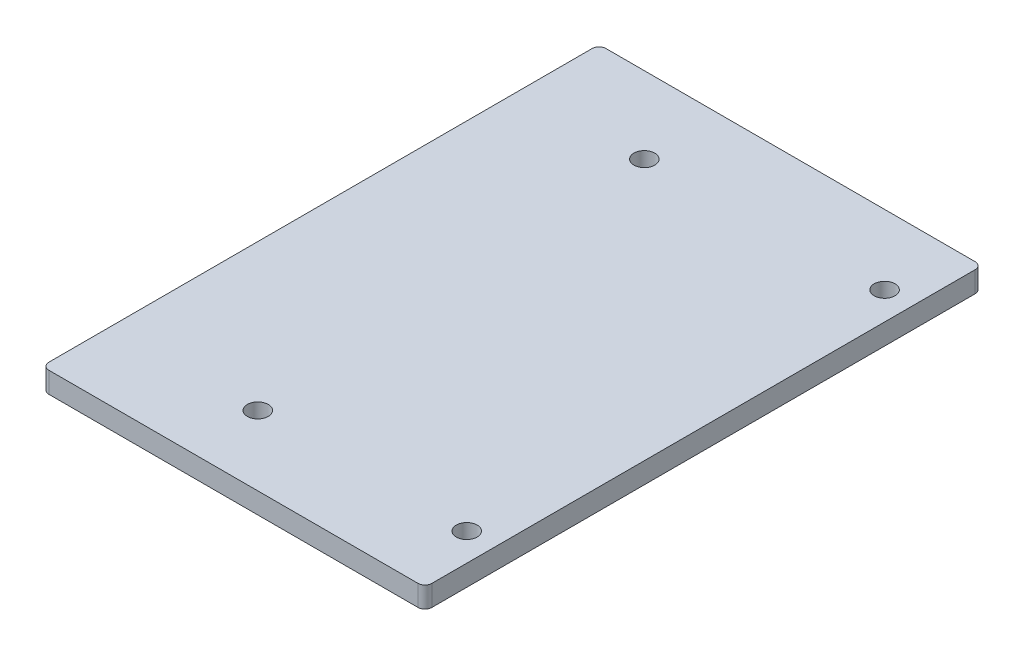
ISO-10303-21;
HEADER;
FILE_DESCRIPTION(('STEP AP214'),'2;1');
FILE_NAME('part.step','',(''),(''),'','','');
FILE_SCHEMA(('AUTOMOTIVE_DESIGN { 1 0 10303 214 1 1 1 1 }'));
ENDSEC;
DATA;
#1=APPLICATION_CONTEXT('core data for automotive mechanical design processes');
#2=APPLICATION_PROTOCOL_DEFINITION('international standard','automotive_design',2000,#1);
#3=PRODUCT_CONTEXT('',#1,'mechanical');
#4=PRODUCT('Part','Part','',(#3));
#5=PRODUCT_RELATED_PRODUCT_CATEGORY('part','',(#4));
#6=PRODUCT_DEFINITION_FORMATION('','',#4);
#7=PRODUCT_DEFINITION_CONTEXT('part definition',#1,'design');
#8=PRODUCT_DEFINITION('design','',#6,#7);
#9=PRODUCT_DEFINITION_SHAPE('','',#8);
#10=(LENGTH_UNIT() NAMED_UNIT(*) SI_UNIT(.MILLI.,.METRE.));
#11=(NAMED_UNIT(*) PLANE_ANGLE_UNIT() SI_UNIT($,.RADIAN.));
#12=(NAMED_UNIT(*) SI_UNIT($,.STERADIAN.) SOLID_ANGLE_UNIT());
#13=UNCERTAINTY_MEASURE_WITH_UNIT(LENGTH_MEASURE(1.E-05),#10,'distance_accuracy_value','');
#14=(GEOMETRIC_REPRESENTATION_CONTEXT(3) GLOBAL_UNCERTAINTY_ASSIGNED_CONTEXT((#13)) GLOBAL_UNIT_ASSIGNED_CONTEXT((#10,
#11,#12)) REPRESENTATION_CONTEXT('',''));
#15=CARTESIAN_POINT('',(0.,0.,0.));
#16=DIRECTION('',(0.,0.,1.));
#17=DIRECTION('',(1.,0.,0.));
#18=AXIS2_PLACEMENT_3D('',#15,#16,#17);
#19=CARTESIAN_POINT('',(0.,3.,0.));
#20=DIRECTION('',(0.,1.,0.));
#21=DIRECTION('',(0.,0.,1.));
#22=AXIS2_PLACEMENT_3D('',#19,#20,#21);
#23=PLANE('',#22);
#24=CARTESIAN_POINT('',(21.,3.,70.));
#25=DIRECTION('',(0.,1.,0.));
#26=DIRECTION('',(0.,0.,1.));
#27=AXIS2_PLACEMENT_3D('',#24,#25,#26);
#28=CIRCLE('',#27,1.5);
#29=CARTESIAN_POINT('',(21.,3.,71.5));
#30=VERTEX_POINT('',#29);
#31=EDGE_CURVE('E260',#30,#30,#28,.T.);
#32=ORIENTED_EDGE('',*,*,#31,.F.);
#33=EDGE_LOOP('',(#32));
#34=FACE_BOUND('',#33,.T.);
#35=CARTESIAN_POINT('',(17.5,3.,11.));
#36=DIRECTION('',(0.,1.,0.));
#37=DIRECTION('',(0.,0.,1.));
#38=AXIS2_PLACEMENT_3D('',#35,#36,#37);
#39=CIRCLE('',#38,1.5);
#40=CARTESIAN_POINT('',(17.5,3.,12.5));
#41=VERTEX_POINT('',#40);
#42=EDGE_CURVE('E196',#41,#41,#39,.T.);
#43=ORIENTED_EDGE('',*,*,#42,.F.);
#44=EDGE_LOOP('',(#43));
#45=FACE_BOUND('',#44,.T.);
#46=DIRECTION('',(0.,0.,-1.));
#47=VECTOR('',#46,1.);
#48=CARTESIAN_POINT('',(55.,3.,0.));
#49=LINE('',#48,#47);
#50=CARTESIAN_POINT('',(55.,3.,79.));
#51=VERTEX_POINT('',#50);
#52=CARTESIAN_POINT('',(55.,3.,1.));
#53=VERTEX_POINT('',#52);
#54=EDGE_CURVE('E184',#51,#53,#49,.T.);
#55=ORIENTED_EDGE('',*,*,#54,.T.);
#56=CARTESIAN_POINT('',(54.,3.,1.));
#57=DIRECTION('',(0.,1.,0.));
#58=DIRECTION('',(0.,0.,1.));
#59=AXIS2_PLACEMENT_3D('',#56,#57,#58);
#60=CIRCLE('',#59,1.);
#61=CARTESIAN_POINT('',(54.,3.,0.));
#62=VERTEX_POINT('',#61);
#63=EDGE_CURVE('E172',#53,#62,#60,.T.);
#64=ORIENTED_EDGE('',*,*,#63,.T.);
#65=DIRECTION('',(-1.,0.,0.));
#66=VECTOR('',#65,1.);
#67=CARTESIAN_POINT('',(0.,3.,0.));
#68=LINE('',#67,#66);
#69=CARTESIAN_POINT('',(1.,3.,0.));
#70=VERTEX_POINT('',#69);
#71=EDGE_CURVE('E130',#62,#70,#68,.T.);
#72=ORIENTED_EDGE('',*,*,#71,.T.);
#73=CARTESIAN_POINT('',(1.,3.,1.));
#74=DIRECTION('',(0.,1.,0.));
#75=DIRECTION('',(0.,0.,1.));
#76=AXIS2_PLACEMENT_3D('',#73,#74,#75);
#77=CIRCLE('',#76,1.);
#78=CARTESIAN_POINT('',(0.,3.,1.));
#79=VERTEX_POINT('',#78);
#80=EDGE_CURVE('E169',#70,#79,#77,.T.);
#81=ORIENTED_EDGE('',*,*,#80,.T.);
#82=DIRECTION('',(0.,0.,1.));
#83=VECTOR('',#82,1.);
#84=CARTESIAN_POINT('',(0.,3.,0.));
#85=LINE('',#84,#83);
#86=CARTESIAN_POINT('',(0.,3.,79.));
#87=VERTEX_POINT('',#86);
#88=EDGE_CURVE('E139',#79,#87,#85,.T.);
#89=ORIENTED_EDGE('',*,*,#88,.T.);
#90=CARTESIAN_POINT('',(1.00000000000001,3.,79.));
#91=DIRECTION('',(0.,1.,0.));
#92=DIRECTION('',(0.,0.,1.));
#93=AXIS2_PLACEMENT_3D('',#90,#91,#92);
#94=CIRCLE('',#93,1.);
#95=CARTESIAN_POINT('',(1.00000000000001,3.,80.));
#96=VERTEX_POINT('',#95);
#97=EDGE_CURVE('E64',#87,#96,#94,.T.);
#98=ORIENTED_EDGE('',*,*,#97,.T.);
#99=DIRECTION('',(1.,0.,0.));
#100=VECTOR('',#99,1.);
#101=CARTESIAN_POINT('',(0.,3.,80.));
#102=LINE('',#101,#100);
#103=CARTESIAN_POINT('',(54.,3.,80.));
#104=VERTEX_POINT('',#103);
#105=EDGE_CURVE('E144',#96,#104,#102,.T.);
#106=ORIENTED_EDGE('',*,*,#105,.T.);
#107=CARTESIAN_POINT('',(54.,3.,79.));
#108=DIRECTION('',(0.,1.,0.));
#109=DIRECTION('',(0.,0.,1.));
#110=AXIS2_PLACEMENT_3D('',#107,#108,#109);
#111=CIRCLE('',#110,1.);
#112=EDGE_CURVE('E164',#104,#51,#111,.T.);
#113=ORIENTED_EDGE('',*,*,#112,.T.);
#114=EDGE_LOOP('',(#55,#64,#72,#81,#89,#98,#106,#113));
#115=FACE_BOUND('',#114,.T.);
#116=CARTESIAN_POINT('',(51.,3.,10.));
#117=DIRECTION('',(0.,1.,0.));
#118=DIRECTION('',(0.,0.,1.));
#119=AXIS2_PLACEMENT_3D('',#116,#117,#118);
#120=CIRCLE('',#119,1.5);
#121=CARTESIAN_POINT('',(51.,3.,11.5));
#122=VERTEX_POINT('',#121);
#123=EDGE_CURVE('E268',#122,#122,#120,.T.);
#124=ORIENTED_EDGE('',*,*,#123,.F.);
#125=EDGE_LOOP('',(#124));
#126=FACE_BOUND('',#125,.T.);
#127=CARTESIAN_POINT('',(51.,3.,70.));
#128=DIRECTION('',(0.,1.,0.));
#129=DIRECTION('',(0.,0.,1.));
#130=AXIS2_PLACEMENT_3D('',#127,#128,#129);
#131=CIRCLE('',#130,1.5);
#132=CARTESIAN_POINT('',(51.,3.,71.5));
#133=VERTEX_POINT('',#132);
#134=EDGE_CURVE('E249',#133,#133,#131,.T.);
#135=ORIENTED_EDGE('',*,*,#134,.F.);
#136=EDGE_LOOP('',(#135));
#137=FACE_BOUND('',#136,.T.);
#138=ADVANCED_FACE('F42',(#34,#45,#115,#126,#137),#23,.T.);
#139=CARTESIAN_POINT('',(0.,0.,0.));
#140=DIRECTION('',(0.,1.,0.));
#141=DIRECTION('',(0.,0.,1.));
#142=AXIS2_PLACEMENT_3D('',#139,#140,#141);
#143=PLANE('',#142);
#144=DIRECTION('',(-1.,0.,0.));
#145=VECTOR('',#144,1.);
#146=CARTESIAN_POINT('',(0.,0.,0.));
#147=LINE('',#146,#145);
#148=CARTESIAN_POINT('',(54.,0.,0.));
#149=VERTEX_POINT('',#148);
#150=CARTESIAN_POINT('',(1.,0.,0.));
#151=VERTEX_POINT('',#150);
#152=EDGE_CURVE('E127',#149,#151,#147,.T.);
#153=ORIENTED_EDGE('',*,*,#152,.F.);
#154=CARTESIAN_POINT('',(54.,0.,1.));
#155=DIRECTION('',(0.,1.,0.));
#156=DIRECTION('',(0.,0.,1.));
#157=AXIS2_PLACEMENT_3D('',#154,#155,#156);
#158=CIRCLE('',#157,1.);
#159=CARTESIAN_POINT('',(55.,0.,1.));
#160=VERTEX_POINT('',#159);
#161=EDGE_CURVE('E109',#149,#160,#158,.F.);
#162=ORIENTED_EDGE('',*,*,#161,.T.);
#163=DIRECTION('',(0.,0.,-1.));
#164=VECTOR('',#163,1.);
#165=CARTESIAN_POINT('',(55.,0.,0.));
#166=LINE('',#165,#164);
#167=CARTESIAN_POINT('',(55.,0.,79.));
#168=VERTEX_POINT('',#167);
#169=EDGE_CURVE('E140',#168,#160,#166,.T.);
#170=ORIENTED_EDGE('',*,*,#169,.F.);
#171=CARTESIAN_POINT('',(54.,0.,79.));
#172=DIRECTION('',(0.,1.,0.));
#173=DIRECTION('',(0.,0.,1.));
#174=AXIS2_PLACEMENT_3D('',#171,#172,#173);
#175=CIRCLE('',#174,1.);
#176=CARTESIAN_POINT('',(54.,0.,80.));
#177=VERTEX_POINT('',#176);
#178=EDGE_CURVE('E132',#168,#177,#175,.F.);
#179=ORIENTED_EDGE('',*,*,#178,.T.);
#180=DIRECTION('',(1.,0.,0.));
#181=VECTOR('',#180,1.);
#182=CARTESIAN_POINT('',(0.,0.,80.));
#183=LINE('',#182,#181);
#184=CARTESIAN_POINT('',(1.00000000000001,0.,80.));
#185=VERTEX_POINT('',#184);
#186=EDGE_CURVE('E146',#185,#177,#183,.T.);
#187=ORIENTED_EDGE('',*,*,#186,.F.);
#188=CARTESIAN_POINT('',(1.00000000000001,0.,79.));
#189=DIRECTION('',(0.,1.,0.));
#190=DIRECTION('',(0.,0.,1.));
#191=AXIS2_PLACEMENT_3D('',#188,#189,#190);
#192=CIRCLE('',#191,1.);
#193=CARTESIAN_POINT('',(0.,0.,79.));
#194=VERTEX_POINT('',#193);
#195=EDGE_CURVE('E154',#185,#194,#192,.F.);
#196=ORIENTED_EDGE('',*,*,#195,.T.);
#197=DIRECTION('',(0.,0.,1.));
#198=VECTOR('',#197,1.);
#199=CARTESIAN_POINT('',(0.,0.,0.));
#200=LINE('',#199,#198);
#201=CARTESIAN_POINT('',(0.,0.,1.));
#202=VERTEX_POINT('',#201);
#203=EDGE_CURVE('E193',#202,#194,#200,.T.);
#204=ORIENTED_EDGE('',*,*,#203,.F.);
#205=CARTESIAN_POINT('',(1.,0.,1.));
#206=DIRECTION('',(0.,1.,0.));
#207=DIRECTION('',(0.,0.,1.));
#208=AXIS2_PLACEMENT_3D('',#205,#206,#207);
#209=CIRCLE('',#208,1.);
#210=EDGE_CURVE('E121',#202,#151,#209,.F.);
#211=ORIENTED_EDGE('',*,*,#210,.T.);
#212=EDGE_LOOP('',(#153,#162,#170,#179,#187,#196,#204,#211));
#213=FACE_BOUND('',#212,.T.);
#214=CARTESIAN_POINT('',(17.5,0.,11.));
#215=DIRECTION('',(0.,1.,0.));
#216=DIRECTION('',(0.,0.,1.));
#217=AXIS2_PLACEMENT_3D('',#214,#215,#216);
#218=CIRCLE('',#217,1.5);
#219=CARTESIAN_POINT('',(17.5,0.,12.5));
#220=VERTEX_POINT('',#219);
#221=EDGE_CURVE('E272',#220,#220,#218,.T.);
#222=ORIENTED_EDGE('',*,*,#221,.T.);
#223=EDGE_LOOP('',(#222));
#224=FACE_BOUND('',#223,.T.);
#225=CARTESIAN_POINT('',(51.,0.,10.));
#226=DIRECTION('',(0.,1.,0.));
#227=DIRECTION('',(0.,0.,1.));
#228=AXIS2_PLACEMENT_3D('',#225,#226,#227);
#229=CIRCLE('',#228,1.5);
#230=CARTESIAN_POINT('',(51.,0.,11.5));
#231=VERTEX_POINT('',#230);
#232=EDGE_CURVE('E264',#231,#231,#229,.T.);
#233=ORIENTED_EDGE('',*,*,#232,.T.);
#234=EDGE_LOOP('',(#233));
#235=FACE_BOUND('',#234,.T.);
#236=CARTESIAN_POINT('',(21.,0.,70.));
#237=DIRECTION('',(0.,1.,0.));
#238=DIRECTION('',(0.,0.,1.));
#239=AXIS2_PLACEMENT_3D('',#236,#237,#238);
#240=CIRCLE('',#239,1.5);
#241=CARTESIAN_POINT('',(21.,0.,71.5));
#242=VERTEX_POINT('',#241);
#243=EDGE_CURVE('E257',#242,#242,#240,.T.);
#244=ORIENTED_EDGE('',*,*,#243,.T.);
#245=EDGE_LOOP('',(#244));
#246=FACE_BOUND('',#245,.T.);
#247=CARTESIAN_POINT('',(51.,0.,70.));
#248=DIRECTION('',(0.,1.,0.));
#249=DIRECTION('',(0.,0.,1.));
#250=AXIS2_PLACEMENT_3D('',#247,#248,#249);
#251=CIRCLE('',#250,1.5);
#252=CARTESIAN_POINT('',(51.,0.,71.5));
#253=VERTEX_POINT('',#252);
#254=EDGE_CURVE('E252',#253,#253,#251,.T.);
#255=ORIENTED_EDGE('',*,*,#254,.T.);
#256=EDGE_LOOP('',(#255));
#257=FACE_BOUND('',#256,.T.);
#258=ADVANCED_FACE('F135',(#213,#224,#235,#246,#257),#143,.F.);
#259=CARTESIAN_POINT('',(0.,3.,0.));
#260=DIRECTION('',(1.,0.,0.));
#261=DIRECTION('',(0.,0.,-1.));
#262=AXIS2_PLACEMENT_3D('',#259,#260,#261);
#263=PLANE('',#262);
#264=ORIENTED_EDGE('',*,*,#88,.F.);
#265=DIRECTION('',(0.,-1.,0.));
#266=VECTOR('',#265,1.);
#267=CARTESIAN_POINT('',(0.,3.,1.));
#268=LINE('',#267,#266);
#269=EDGE_CURVE('E178',#79,#202,#268,.T.);
#270=ORIENTED_EDGE('',*,*,#269,.T.);
#271=ORIENTED_EDGE('',*,*,#203,.T.);
#272=DIRECTION('',(0.,-1.,0.));
#273=VECTOR('',#272,1.);
#274=CARTESIAN_POINT('',(0.,3.,79.));
#275=LINE('',#274,#273);
#276=EDGE_CURVE('E175',#194,#87,#275,.F.);
#277=ORIENTED_EDGE('',*,*,#276,.T.);
#278=EDGE_LOOP('',(#264,#270,#271,#277));
#279=FACE_BOUND('',#278,.T.);
#280=ADVANCED_FACE('F215',(#279),#263,.F.);
#281=CARTESIAN_POINT('',(0.,3.,80.));
#282=DIRECTION('',(0.,0.,-1.));
#283=DIRECTION('',(-1.,0.,0.));
#284=AXIS2_PLACEMENT_3D('',#281,#282,#283);
#285=PLANE('',#284);
#286=ORIENTED_EDGE('',*,*,#105,.F.);
#287=DIRECTION('',(0.,-1.,0.));
#288=VECTOR('',#287,1.);
#289=CARTESIAN_POINT('',(1.00000000000001,3.,80.));
#290=LINE('',#289,#288);
#291=EDGE_CURVE('E11',#96,#185,#290,.T.);
#292=ORIENTED_EDGE('',*,*,#291,.T.);
#293=ORIENTED_EDGE('',*,*,#186,.T.);
#294=DIRECTION('',(0.,-1.,0.));
#295=VECTOR('',#294,1.);
#296=CARTESIAN_POINT('',(54.,3.,80.));
#297=LINE('',#296,#295);
#298=EDGE_CURVE('E51',#177,#104,#297,.F.);
#299=ORIENTED_EDGE('',*,*,#298,.T.);
#300=EDGE_LOOP('',(#286,#292,#293,#299));
#301=FACE_BOUND('',#300,.T.);
#302=ADVANCED_FACE('F199',(#301),#285,.F.);
#303=CARTESIAN_POINT('',(55.,3.,0.));
#304=DIRECTION('',(-1.,0.,0.));
#305=DIRECTION('',(0.,0.,1.));
#306=AXIS2_PLACEMENT_3D('',#303,#304,#305);
#307=PLANE('',#306);
#308=ORIENTED_EDGE('',*,*,#169,.T.);
#309=DIRECTION('',(0.,-1.,0.));
#310=VECTOR('',#309,1.);
#311=CARTESIAN_POINT('',(55.,3.,1.));
#312=LINE('',#311,#310);
#313=EDGE_CURVE('E114',#160,#53,#312,.F.);
#314=ORIENTED_EDGE('',*,*,#313,.T.);
#315=ORIENTED_EDGE('',*,*,#54,.F.);
#316=DIRECTION('',(0.,-1.,0.));
#317=VECTOR('',#316,1.);
#318=CARTESIAN_POINT('',(55.,3.,79.));
#319=LINE('',#318,#317);
#320=EDGE_CURVE('E120',#51,#168,#319,.T.);
#321=ORIENTED_EDGE('',*,*,#320,.T.);
#322=EDGE_LOOP('',(#308,#314,#315,#321));
#323=FACE_BOUND('',#322,.T.);
#324=ADVANCED_FACE('F206',(#323),#307,.F.);
#325=CARTESIAN_POINT('',(0.,3.,0.));
#326=DIRECTION('',(0.,0.,1.));
#327=DIRECTION('',(1.,0.,0.));
#328=AXIS2_PLACEMENT_3D('',#325,#326,#327);
#329=PLANE('',#328);
#330=ORIENTED_EDGE('',*,*,#71,.F.);
#331=DIRECTION('',(0.,-1.,0.));
#332=VECTOR('',#331,1.);
#333=CARTESIAN_POINT('',(54.,3.,0.));
#334=LINE('',#333,#332);
#335=EDGE_CURVE('E113',#62,#149,#334,.T.);
#336=ORIENTED_EDGE('',*,*,#335,.T.);
#337=ORIENTED_EDGE('',*,*,#152,.T.);
#338=DIRECTION('',(0.,-1.,0.));
#339=VECTOR('',#338,1.);
#340=CARTESIAN_POINT('',(1.,3.,0.));
#341=LINE('',#340,#339);
#342=EDGE_CURVE('E133',#151,#70,#341,.F.);
#343=ORIENTED_EDGE('',*,*,#342,.T.);
#344=EDGE_LOOP('',(#330,#336,#337,#343));
#345=FACE_BOUND('',#344,.T.);
#346=ADVANCED_FACE('F126',(#345),#329,.F.);
#347=CARTESIAN_POINT('',(17.5,3.,11.));
#348=DIRECTION('',(0.,-1.,0.));
#349=DIRECTION('',(0.,0.,-1.));
#350=AXIS2_PLACEMENT_3D('',#347,#348,#349);
#351=CYLINDRICAL_SURFACE('',#350,1.5);
#352=ORIENTED_EDGE('',*,*,#42,.T.);
#353=EDGE_LOOP('',(#352));
#354=FACE_BOUND('',#353,.T.);
#355=ORIENTED_EDGE('',*,*,#221,.F.);
#356=EDGE_LOOP('',(#355));
#357=FACE_BOUND('',#356,.T.);
#358=ADVANCED_FACE('F213',(#354,#357),#351,.F.);
#359=CARTESIAN_POINT('',(51.,3.,10.));
#360=DIRECTION('',(0.,-1.,0.));
#361=DIRECTION('',(0.,0.,-1.));
#362=AXIS2_PLACEMENT_3D('',#359,#360,#361);
#363=CYLINDRICAL_SURFACE('',#362,1.5);
#364=ORIENTED_EDGE('',*,*,#123,.T.);
#365=EDGE_LOOP('',(#364));
#366=FACE_BOUND('',#365,.T.);
#367=ORIENTED_EDGE('',*,*,#232,.F.);
#368=EDGE_LOOP('',(#367));
#369=FACE_BOUND('',#368,.T.);
#370=ADVANCED_FACE('F229',(#366,#369),#363,.F.);
#371=CARTESIAN_POINT('',(21.,3.,70.));
#372=DIRECTION('',(0.,-1.,0.));
#373=DIRECTION('',(0.,0.,-1.));
#374=AXIS2_PLACEMENT_3D('',#371,#372,#373);
#375=CYLINDRICAL_SURFACE('',#374,1.5);
#376=ORIENTED_EDGE('',*,*,#31,.T.);
#377=EDGE_LOOP('',(#376));
#378=FACE_BOUND('',#377,.T.);
#379=ORIENTED_EDGE('',*,*,#243,.F.);
#380=EDGE_LOOP('',(#379));
#381=FACE_BOUND('',#380,.T.);
#382=ADVANCED_FACE('F233',(#378,#381),#375,.F.);
#383=CARTESIAN_POINT('',(51.,3.,70.));
#384=DIRECTION('',(0.,-1.,0.));
#385=DIRECTION('',(0.,0.,-1.));
#386=AXIS2_PLACEMENT_3D('',#383,#384,#385);
#387=CYLINDRICAL_SURFACE('',#386,1.5);
#388=ORIENTED_EDGE('',*,*,#134,.T.);
#389=EDGE_LOOP('',(#388));
#390=FACE_BOUND('',#389,.T.);
#391=ORIENTED_EDGE('',*,*,#254,.F.);
#392=EDGE_LOOP('',(#391));
#393=FACE_BOUND('',#392,.T.);
#394=ADVANCED_FACE('F237',(#390,#393),#387,.F.);
#395=CARTESIAN_POINT('',(54.,3.,1.));
#396=DIRECTION('',(0.,-1.,0.));
#397=DIRECTION('',(0.,0.,-1.));
#398=AXIS2_PLACEMENT_3D('',#395,#396,#397);
#399=CYLINDRICAL_SURFACE('',#398,1.);
#400=ORIENTED_EDGE('',*,*,#63,.F.);
#401=ORIENTED_EDGE('',*,*,#313,.F.);
#402=ORIENTED_EDGE('',*,*,#161,.F.);
#403=ORIENTED_EDGE('',*,*,#335,.F.);
#404=EDGE_LOOP('',(#400,#401,#402,#403));
#405=FACE_BOUND('',#404,.T.);
#406=ADVANCED_FACE('F112',(#405),#399,.T.);
#407=CARTESIAN_POINT('',(1.,3.,1.));
#408=DIRECTION('',(0.,-1.,0.));
#409=DIRECTION('',(0.,0.,-1.));
#410=AXIS2_PLACEMENT_3D('',#407,#408,#409);
#411=CYLINDRICAL_SURFACE('',#410,1.);
#412=ORIENTED_EDGE('',*,*,#80,.F.);
#413=ORIENTED_EDGE('',*,*,#342,.F.);
#414=ORIENTED_EDGE('',*,*,#210,.F.);
#415=ORIENTED_EDGE('',*,*,#269,.F.);
#416=EDGE_LOOP('',(#412,#413,#414,#415));
#417=FACE_BOUND('',#416,.T.);
#418=ADVANCED_FACE('F244',(#417),#411,.T.);
#419=CARTESIAN_POINT('',(1.00000000000001,3.,79.));
#420=DIRECTION('',(0.,-1.,0.));
#421=DIRECTION('',(0.,0.,-1.));
#422=AXIS2_PLACEMENT_3D('',#419,#420,#421);
#423=CYLINDRICAL_SURFACE('',#422,1.);
#424=ORIENTED_EDGE('',*,*,#97,.F.);
#425=ORIENTED_EDGE('',*,*,#276,.F.);
#426=ORIENTED_EDGE('',*,*,#195,.F.);
#427=ORIENTED_EDGE('',*,*,#291,.F.);
#428=EDGE_LOOP('',(#424,#425,#426,#427));
#429=FACE_BOUND('',#428,.T.);
#430=ADVANCED_FACE('F294',(#429),#423,.T.);
#431=CARTESIAN_POINT('',(54.,3.,79.));
#432=DIRECTION('',(0.,-1.,0.));
#433=DIRECTION('',(0.,0.,-1.));
#434=AXIS2_PLACEMENT_3D('',#431,#432,#433);
#435=CYLINDRICAL_SURFACE('',#434,1.);
#436=ORIENTED_EDGE('',*,*,#112,.F.);
#437=ORIENTED_EDGE('',*,*,#298,.F.);
#438=ORIENTED_EDGE('',*,*,#178,.F.);
#439=ORIENTED_EDGE('',*,*,#320,.F.);
#440=EDGE_LOOP('',(#436,#437,#438,#439));
#441=FACE_BOUND('',#440,.T.);
#442=ADVANCED_FACE('F44',(#441),#435,.T.);
#443=CLOSED_SHELL('',(#138,#258,#280,#302,#324,#346,#358,#370,#382,#394,#406,#418,#430,#442));
#444=MANIFOLD_SOLID_BREP('B2',#443);
#445=ADVANCED_BREP_SHAPE_REPRESENTATION('',(#18,#444),#14);
#446=SHAPE_DEFINITION_REPRESENTATION(#9,#445);
ENDSEC;
END-ISO-10303-21;
